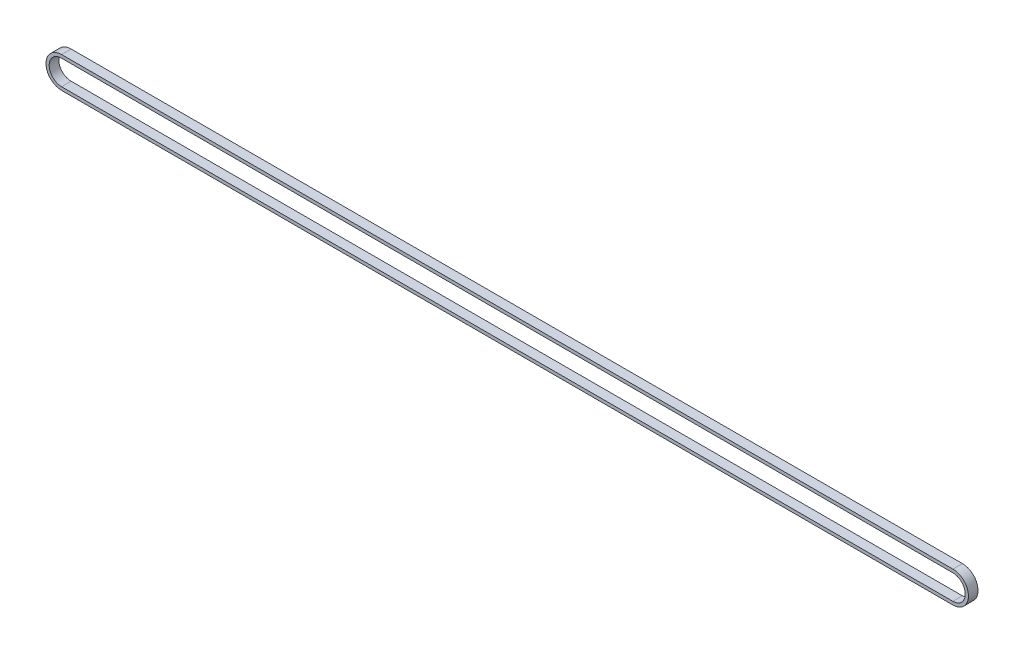
ISO-10303-21;
HEADER;
FILE_DESCRIPTION(('STEP AP214'),'2;1');
FILE_NAME('part.step','',(''),(''),'','','');
FILE_SCHEMA(('AUTOMOTIVE_DESIGN { 1 0 10303 214 1 1 1 1 }'));
ENDSEC;
DATA;
#1=APPLICATION_CONTEXT('core data for automotive mechanical design processes');
#2=APPLICATION_PROTOCOL_DEFINITION('international standard','automotive_design',2000,#1);
#3=PRODUCT_CONTEXT('',#1,'mechanical');
#4=PRODUCT('Part','Part','',(#3));
#5=PRODUCT_RELATED_PRODUCT_CATEGORY('part','',(#4));
#6=PRODUCT_DEFINITION_FORMATION('','',#4);
#7=PRODUCT_DEFINITION_CONTEXT('part definition',#1,'design');
#8=PRODUCT_DEFINITION('design','',#6,#7);
#9=PRODUCT_DEFINITION_SHAPE('','',#8);
#10=(LENGTH_UNIT() NAMED_UNIT(*) SI_UNIT(.MILLI.,.METRE.));
#11=(NAMED_UNIT(*) PLANE_ANGLE_UNIT() SI_UNIT($,.RADIAN.));
#12=(NAMED_UNIT(*) SI_UNIT($,.STERADIAN.) SOLID_ANGLE_UNIT());
#13=UNCERTAINTY_MEASURE_WITH_UNIT(LENGTH_MEASURE(1.E-05),#10,'distance_accuracy_value','');
#14=(GEOMETRIC_REPRESENTATION_CONTEXT(3) GLOBAL_UNCERTAINTY_ASSIGNED_CONTEXT((#13)) GLOBAL_UNIT_ASSIGNED_CONTEXT((#10,
#11,#12)) REPRESENTATION_CONTEXT('',''));
#15=CARTESIAN_POINT('',(0.,0.,0.));
#16=DIRECTION('',(0.,0.,1.));
#17=DIRECTION('',(1.,0.,0.));
#18=AXIS2_PLACEMENT_3D('',#15,#16,#17);
#19=CARTESIAN_POINT('',(0.,0.,6.));
#20=DIRECTION('',(0.,0.,1.));
#21=DIRECTION('',(1.,0.,0.));
#22=AXIS2_PLACEMENT_3D('',#19,#20,#21);
#23=PLANE('',#22);
#24=CARTESIAN_POINT('',(0.,0.,6.));
#25=DIRECTION('',(0.,0.,1.));
#26=DIRECTION('',(1.,0.,0.));
#27=AXIS2_PLACEMENT_3D('',#24,#25,#26);
#28=CIRCLE('',#27,9.75000000000004);
#29=CARTESIAN_POINT('',(0.,9.75000000000004,6.));
#30=VERTEX_POINT('',#29);
#31=CARTESIAN_POINT('',(0.,-9.75000000000004,6.));
#32=VERTEX_POINT('',#31);
#33=EDGE_CURVE('E157',#30,#32,#28,.T.);
#34=ORIENTED_EDGE('',*,*,#33,.T.);
#35=DIRECTION('',(1.,0.,0.));
#36=VECTOR('',#35,1.);
#37=CARTESIAN_POINT('',(0.,-9.75000000000004,6.));
#38=LINE('',#37,#36);
#39=CARTESIAN_POINT('',(559.,-9.75,6.));
#40=VERTEX_POINT('',#39);
#41=EDGE_CURVE('E161',#32,#40,#38,.T.);
#42=ORIENTED_EDGE('',*,*,#41,.T.);
#43=CARTESIAN_POINT('',(559.,0.,6.));
#44=DIRECTION('',(0.,0.,1.));
#45=DIRECTION('',(1.,0.,0.));
#46=AXIS2_PLACEMENT_3D('',#43,#44,#45);
#47=CIRCLE('',#46,9.75);
#48=CARTESIAN_POINT('',(559.,9.75,6.));
#49=VERTEX_POINT('',#48);
#50=EDGE_CURVE('E165',#40,#49,#47,.T.);
#51=ORIENTED_EDGE('',*,*,#50,.T.);
#52=DIRECTION('',(-1.,0.,0.));
#53=VECTOR('',#52,1.);
#54=CARTESIAN_POINT('',(0.,9.75000000000004,6.));
#55=LINE('',#54,#53);
#56=EDGE_CURVE('E168',#49,#30,#55,.T.);
#57=ORIENTED_EDGE('',*,*,#56,.T.);
#58=EDGE_LOOP('',(#34,#42,#51,#57));
#59=FACE_BOUND('',#58,.T.);
#60=DIRECTION('',(1.,0.,0.));
#61=VECTOR('',#60,1.);
#62=CARTESIAN_POINT('',(0.,-7.75000000000003,6.));
#63=LINE('',#62,#61);
#64=CARTESIAN_POINT('',(0.,-7.75000000000003,6.));
#65=VERTEX_POINT('',#64);
#66=CARTESIAN_POINT('',(559.,-7.75,6.));
#67=VERTEX_POINT('',#66);
#68=EDGE_CURVE('E118',#65,#67,#63,.T.);
#69=ORIENTED_EDGE('',*,*,#68,.F.);
#70=CARTESIAN_POINT('',(0.,0.,6.));
#71=DIRECTION('',(0.,0.,1.));
#72=DIRECTION('',(1.,0.,0.));
#73=AXIS2_PLACEMENT_3D('',#70,#71,#72);
#74=CIRCLE('',#73,7.75000000000003);
#75=CARTESIAN_POINT('',(0.,7.75000000000003,6.));
#76=VERTEX_POINT('',#75);
#77=EDGE_CURVE('E109',#76,#65,#74,.T.);
#78=ORIENTED_EDGE('',*,*,#77,.F.);
#79=DIRECTION('',(-1.,0.,0.));
#80=VECTOR('',#79,1.);
#81=CARTESIAN_POINT('',(0.,7.75000000000003,6.));
#82=LINE('',#81,#80);
#83=CARTESIAN_POINT('',(559.,7.75,6.));
#84=VERTEX_POINT('',#83);
#85=EDGE_CURVE('E135',#84,#76,#82,.T.);
#86=ORIENTED_EDGE('',*,*,#85,.F.);
#87=CARTESIAN_POINT('',(559.,0.,6.));
#88=DIRECTION('',(0.,0.,1.));
#89=DIRECTION('',(1.,0.,0.));
#90=AXIS2_PLACEMENT_3D('',#87,#88,#89);
#91=CIRCLE('',#90,7.75);
#92=EDGE_CURVE('E131',#67,#84,#91,.T.);
#93=ORIENTED_EDGE('',*,*,#92,.F.);
#94=EDGE_LOOP('',(#69,#78,#86,#93));
#95=FACE_BOUND('',#94,.T.);
#96=ADVANCED_FACE('F43',(#59,#95),#23,.T.);
#97=CARTESIAN_POINT('',(0.,0.,0.));
#98=DIRECTION('',(0.,0.,1.));
#99=DIRECTION('',(1.,0.,0.));
#100=AXIS2_PLACEMENT_3D('',#97,#98,#99);
#101=PLANE('',#100);
#102=CARTESIAN_POINT('',(0.,0.,0.));
#103=DIRECTION('',(0.,0.,1.));
#104=DIRECTION('',(1.,0.,0.));
#105=AXIS2_PLACEMENT_3D('',#102,#103,#104);
#106=CIRCLE('',#105,9.75000000000004);
#107=CARTESIAN_POINT('',(0.,9.75000000000004,0.));
#108=VERTEX_POINT('',#107);
#109=CARTESIAN_POINT('',(0.,-9.75000000000004,0.));
#110=VERTEX_POINT('',#109);
#111=EDGE_CURVE('E127',#108,#110,#106,.T.);
#112=ORIENTED_EDGE('',*,*,#111,.F.);
#113=DIRECTION('',(-1.,0.,0.));
#114=VECTOR('',#113,1.);
#115=CARTESIAN_POINT('',(0.,9.75000000000004,0.));
#116=LINE('',#115,#114);
#117=CARTESIAN_POINT('',(559.,9.75,0.));
#118=VERTEX_POINT('',#117);
#119=EDGE_CURVE('E162',#118,#108,#116,.T.);
#120=ORIENTED_EDGE('',*,*,#119,.F.);
#121=CARTESIAN_POINT('',(559.,0.,0.));
#122=DIRECTION('',(0.,0.,1.));
#123=DIRECTION('',(1.,0.,0.));
#124=AXIS2_PLACEMENT_3D('',#121,#122,#123);
#125=CIRCLE('',#124,9.75);
#126=CARTESIAN_POINT('',(559.,-9.75,0.));
#127=VERTEX_POINT('',#126);
#128=EDGE_CURVE('E178',#127,#118,#125,.T.);
#129=ORIENTED_EDGE('',*,*,#128,.F.);
#130=DIRECTION('',(1.,0.,0.));
#131=VECTOR('',#130,1.);
#132=CARTESIAN_POINT('',(0.,-9.75000000000004,0.));
#133=LINE('',#132,#131);
#134=EDGE_CURVE('E175',#110,#127,#133,.T.);
#135=ORIENTED_EDGE('',*,*,#134,.F.);
#136=EDGE_LOOP('',(#112,#120,#129,#135));
#137=FACE_BOUND('',#136,.T.);
#138=CARTESIAN_POINT('',(0.,0.,0.));
#139=DIRECTION('',(0.,0.,1.));
#140=DIRECTION('',(1.,0.,0.));
#141=AXIS2_PLACEMENT_3D('',#138,#139,#140);
#142=CIRCLE('',#141,7.75000000000003);
#143=CARTESIAN_POINT('',(0.,7.75000000000003,0.));
#144=VERTEX_POINT('',#143);
#145=CARTESIAN_POINT('',(0.,-7.75000000000003,0.));
#146=VERTEX_POINT('',#145);
#147=EDGE_CURVE('E67',#144,#146,#142,.T.);
#148=ORIENTED_EDGE('',*,*,#147,.T.);
#149=DIRECTION('',(1.,0.,0.));
#150=VECTOR('',#149,1.);
#151=CARTESIAN_POINT('',(0.,-7.75000000000003,0.));
#152=LINE('',#151,#150);
#153=CARTESIAN_POINT('',(559.,-7.75,0.));
#154=VERTEX_POINT('',#153);
#155=EDGE_CURVE('E125',#146,#154,#152,.T.);
#156=ORIENTED_EDGE('',*,*,#155,.T.);
#157=CARTESIAN_POINT('',(559.,0.,0.));
#158=DIRECTION('',(0.,0.,1.));
#159=DIRECTION('',(1.,0.,0.));
#160=AXIS2_PLACEMENT_3D('',#157,#158,#159);
#161=CIRCLE('',#160,7.75);
#162=CARTESIAN_POINT('',(559.,7.75,0.));
#163=VERTEX_POINT('',#162);
#164=EDGE_CURVE('E144',#154,#163,#161,.T.);
#165=ORIENTED_EDGE('',*,*,#164,.T.);
#166=DIRECTION('',(-1.,0.,0.));
#167=VECTOR('',#166,1.);
#168=CARTESIAN_POINT('',(0.,7.75000000000003,0.));
#169=LINE('',#168,#167);
#170=EDGE_CURVE('E119',#163,#144,#169,.T.);
#171=ORIENTED_EDGE('',*,*,#170,.T.);
#172=EDGE_LOOP('',(#148,#156,#165,#171));
#173=FACE_BOUND('',#172,.T.);
#174=ADVANCED_FACE('F201',(#137,#173),#101,.F.);
#175=CARTESIAN_POINT('',(0.,0.,6.));
#176=DIRECTION('',(0.,0.,-1.));
#177=DIRECTION('',(-1.,0.,0.));
#178=AXIS2_PLACEMENT_3D('',#175,#176,#177);
#179=CYLINDRICAL_SURFACE('',#178,9.75000000000004);
#180=ORIENTED_EDGE('',*,*,#111,.T.);
#181=DIRECTION('',(0.,0.,-1.));
#182=VECTOR('',#181,1.);
#183=CARTESIAN_POINT('',(0.,-9.75000000000004,6.));
#184=LINE('',#183,#182);
#185=EDGE_CURVE('E11',#32,#110,#184,.T.);
#186=ORIENTED_EDGE('',*,*,#185,.F.);
#187=ORIENTED_EDGE('',*,*,#33,.F.);
#188=DIRECTION('',(0.,0.,-1.));
#189=VECTOR('',#188,1.);
#190=CARTESIAN_POINT('',(0.,9.75000000000004,6.));
#191=LINE('',#190,#189);
#192=EDGE_CURVE('E171',#30,#108,#191,.T.);
#193=ORIENTED_EDGE('',*,*,#192,.T.);
#194=EDGE_LOOP('',(#180,#186,#187,#193));
#195=FACE_BOUND('',#194,.T.);
#196=ADVANCED_FACE('F45',(#195),#179,.T.);
#197=CARTESIAN_POINT('',(0.,-9.75000000000004,6.));
#198=DIRECTION('',(0.,1.,0.));
#199=DIRECTION('',(-1.,0.,0.));
#200=AXIS2_PLACEMENT_3D('',#197,#198,#199);
#201=PLANE('',#200);
#202=ORIENTED_EDGE('',*,*,#134,.T.);
#203=DIRECTION('',(0.,0.,-1.));
#204=VECTOR('',#203,1.);
#205=CARTESIAN_POINT('',(559.,-9.75,6.));
#206=LINE('',#205,#204);
#207=EDGE_CURVE('E52',#40,#127,#206,.T.);
#208=ORIENTED_EDGE('',*,*,#207,.F.);
#209=ORIENTED_EDGE('',*,*,#41,.F.);
#210=ORIENTED_EDGE('',*,*,#185,.T.);
#211=EDGE_LOOP('',(#202,#208,#209,#210));
#212=FACE_BOUND('',#211,.T.);
#213=ADVANCED_FACE('F211',(#212),#201,.F.);
#214=CARTESIAN_POINT('',(559.,0.,6.));
#215=DIRECTION('',(0.,0.,-1.));
#216=DIRECTION('',(-1.,0.,0.));
#217=AXIS2_PLACEMENT_3D('',#214,#215,#216);
#218=CYLINDRICAL_SURFACE('',#217,9.75);
#219=ORIENTED_EDGE('',*,*,#128,.T.);
#220=DIRECTION('',(0.,0.,-1.));
#221=VECTOR('',#220,1.);
#222=CARTESIAN_POINT('',(559.,9.75,6.));
#223=LINE('',#222,#221);
#224=EDGE_CURVE('E186',#49,#118,#223,.T.);
#225=ORIENTED_EDGE('',*,*,#224,.F.);
#226=ORIENTED_EDGE('',*,*,#50,.F.);
#227=ORIENTED_EDGE('',*,*,#207,.T.);
#228=EDGE_LOOP('',(#219,#225,#226,#227));
#229=FACE_BOUND('',#228,.T.);
#230=ADVANCED_FACE('F195',(#229),#218,.T.);
#231=CARTESIAN_POINT('',(0.,9.75000000000004,6.));
#232=DIRECTION('',(0.,-1.,0.));
#233=DIRECTION('',(1.,0.,0.));
#234=AXIS2_PLACEMENT_3D('',#231,#232,#233);
#235=PLANE('',#234);
#236=ORIENTED_EDGE('',*,*,#119,.T.);
#237=ORIENTED_EDGE('',*,*,#192,.F.);
#238=ORIENTED_EDGE('',*,*,#56,.F.);
#239=ORIENTED_EDGE('',*,*,#224,.T.);
#240=EDGE_LOOP('',(#236,#237,#238,#239));
#241=FACE_BOUND('',#240,.T.);
#242=ADVANCED_FACE('F205',(#241),#235,.F.);
#243=CARTESIAN_POINT('',(0.,0.,6.));
#244=DIRECTION('',(0.,0.,-1.));
#245=DIRECTION('',(-1.,0.,0.));
#246=AXIS2_PLACEMENT_3D('',#243,#244,#245);
#247=CYLINDRICAL_SURFACE('',#246,7.75000000000003);
#248=ORIENTED_EDGE('',*,*,#147,.F.);
#249=DIRECTION('',(0.,0.,-1.));
#250=VECTOR('',#249,1.);
#251=CARTESIAN_POINT('',(0.,7.75000000000003,6.));
#252=LINE('',#251,#250);
#253=EDGE_CURVE('E113',#76,#144,#252,.T.);
#254=ORIENTED_EDGE('',*,*,#253,.F.);
#255=ORIENTED_EDGE('',*,*,#77,.T.);
#256=DIRECTION('',(0.,0.,-1.));
#257=VECTOR('',#256,1.);
#258=CARTESIAN_POINT('',(0.,-7.75000000000003,6.));
#259=LINE('',#258,#257);
#260=EDGE_CURVE('E112',#65,#146,#259,.T.);
#261=ORIENTED_EDGE('',*,*,#260,.T.);
#262=EDGE_LOOP('',(#248,#254,#255,#261));
#263=FACE_BOUND('',#262,.T.);
#264=ADVANCED_FACE('F111',(#263),#247,.F.);
#265=CARTESIAN_POINT('',(0.,-7.75000000000003,6.));
#266=DIRECTION('',(0.,1.,0.));
#267=DIRECTION('',(-1.,0.,0.));
#268=AXIS2_PLACEMENT_3D('',#265,#266,#267);
#269=PLANE('',#268);
#270=ORIENTED_EDGE('',*,*,#155,.F.);
#271=ORIENTED_EDGE('',*,*,#260,.F.);
#272=ORIENTED_EDGE('',*,*,#68,.T.);
#273=DIRECTION('',(0.,0.,-1.));
#274=VECTOR('',#273,1.);
#275=CARTESIAN_POINT('',(559.,-7.75,6.));
#276=LINE('',#275,#274);
#277=EDGE_CURVE('E128',#67,#154,#276,.T.);
#278=ORIENTED_EDGE('',*,*,#277,.T.);
#279=EDGE_LOOP('',(#270,#271,#272,#278));
#280=FACE_BOUND('',#279,.T.);
#281=ADVANCED_FACE('F122',(#280),#269,.T.);
#282=CARTESIAN_POINT('',(559.,0.,6.));
#283=DIRECTION('',(0.,0.,-1.));
#284=DIRECTION('',(-1.,0.,0.));
#285=AXIS2_PLACEMENT_3D('',#282,#283,#284);
#286=CYLINDRICAL_SURFACE('',#285,7.75);
#287=ORIENTED_EDGE('',*,*,#164,.F.);
#288=ORIENTED_EDGE('',*,*,#277,.F.);
#289=ORIENTED_EDGE('',*,*,#92,.T.);
#290=DIRECTION('',(0.,0.,-1.));
#291=VECTOR('',#290,1.);
#292=CARTESIAN_POINT('',(559.,7.75,6.));
#293=LINE('',#292,#291);
#294=EDGE_CURVE('E59',#84,#163,#293,.T.);
#295=ORIENTED_EDGE('',*,*,#294,.T.);
#296=EDGE_LOOP('',(#287,#288,#289,#295));
#297=FACE_BOUND('',#296,.T.);
#298=ADVANCED_FACE('F234',(#297),#286,.F.);
#299=CARTESIAN_POINT('',(0.,7.75000000000003,6.));
#300=DIRECTION('',(0.,-1.,0.));
#301=DIRECTION('',(1.,0.,0.));
#302=AXIS2_PLACEMENT_3D('',#299,#300,#301);
#303=PLANE('',#302);
#304=ORIENTED_EDGE('',*,*,#170,.F.);
#305=ORIENTED_EDGE('',*,*,#294,.F.);
#306=ORIENTED_EDGE('',*,*,#85,.T.);
#307=ORIENTED_EDGE('',*,*,#253,.T.);
#308=EDGE_LOOP('',(#304,#305,#306,#307));
#309=FACE_BOUND('',#308,.T.);
#310=ADVANCED_FACE('F238',(#309),#303,.T.);
#311=CLOSED_SHELL('',(#96,#174,#196,#213,#230,#242,#264,#281,#298,#310));
#312=MANIFOLD_SOLID_BREP('B2',#311);
#313=ADVANCED_BREP_SHAPE_REPRESENTATION('',(#18,#312),#14);
#314=SHAPE_DEFINITION_REPRESENTATION(#9,#313);
ENDSEC;
END-ISO-10303-21;
